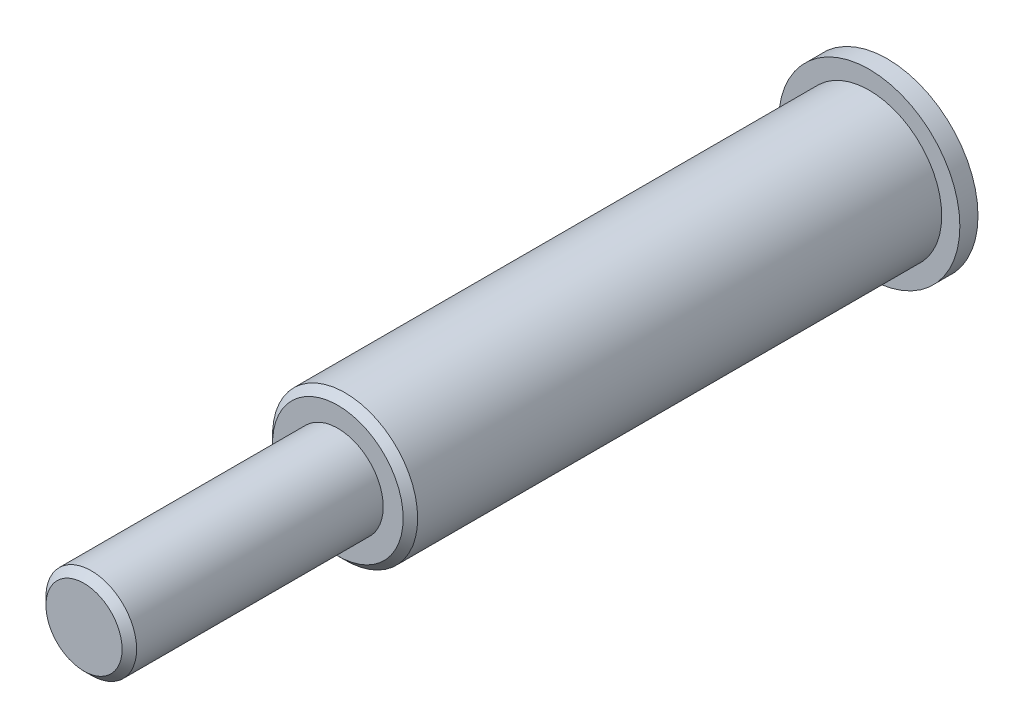
ISO-10303-21;
HEADER;
FILE_DESCRIPTION(('STEP AP214'),'2;1');
FILE_NAME('part.step','',(''),(''),'','','');
FILE_SCHEMA(('AUTOMOTIVE_DESIGN { 1 0 10303 214 1 1 1 1 }'));
ENDSEC;
DATA;
#1=APPLICATION_CONTEXT('core data for automotive mechanical design processes');
#2=APPLICATION_PROTOCOL_DEFINITION('international standard','automotive_design',2000,#1);
#3=PRODUCT_CONTEXT('',#1,'mechanical');
#4=PRODUCT('Part','Part','',(#3));
#5=PRODUCT_RELATED_PRODUCT_CATEGORY('part','',(#4));
#6=PRODUCT_DEFINITION_FORMATION('','',#4);
#7=PRODUCT_DEFINITION_CONTEXT('part definition',#1,'design');
#8=PRODUCT_DEFINITION('design','',#6,#7);
#9=PRODUCT_DEFINITION_SHAPE('','',#8);
#10=(LENGTH_UNIT() NAMED_UNIT(*) SI_UNIT(.MILLI.,.METRE.));
#11=(NAMED_UNIT(*) PLANE_ANGLE_UNIT() SI_UNIT($,.RADIAN.));
#12=(NAMED_UNIT(*) SI_UNIT($,.STERADIAN.) SOLID_ANGLE_UNIT());
#13=UNCERTAINTY_MEASURE_WITH_UNIT(LENGTH_MEASURE(1.E-05),#10,'distance_accuracy_value','');
#14=(GEOMETRIC_REPRESENTATION_CONTEXT(3) GLOBAL_UNCERTAINTY_ASSIGNED_CONTEXT((#13)) GLOBAL_UNIT_ASSIGNED_CONTEXT((#10,
#11,#12)) REPRESENTATION_CONTEXT('',''));
#15=CARTESIAN_POINT('',(0.,0.,0.));
#16=DIRECTION('',(0.,0.,1.));
#17=DIRECTION('',(1.,0.,0.));
#18=AXIS2_PLACEMENT_3D('',#15,#16,#17);
#19=CARTESIAN_POINT('',(0.,0.,29.3));
#20=DIRECTION('',(0.,0.,-1.));
#21=DIRECTION('',(-1.,0.,0.));
#22=AXIS2_PLACEMENT_3D('',#19,#20,#21);
#23=CYLINDRICAL_SURFACE('',#22,4.);
#24=CARTESIAN_POINT('',(0.,0.,28.9));
#25=DIRECTION('',(0.,0.,1.));
#26=DIRECTION('',(1.,0.,0.));
#27=AXIS2_PLACEMENT_3D('',#24,#25,#26);
#28=CIRCLE('',#27,4.);
#29=CARTESIAN_POINT('',(4.,0.,28.9));
#30=VERTEX_POINT('',#29);
#31=EDGE_CURVE('E52',#30,#30,#28,.F.);
#32=ORIENTED_EDGE('',*,*,#31,.T.);
#33=EDGE_LOOP('',(#32));
#34=FACE_BOUND('',#33,.T.);
#35=CARTESIAN_POINT('',(0.,0.,0.));
#36=DIRECTION('',(0.,0.,1.));
#37=DIRECTION('',(1.,0.,0.));
#38=AXIS2_PLACEMENT_3D('',#35,#36,#37);
#39=CIRCLE('',#38,4.);
#40=CARTESIAN_POINT('',(4.,0.,0.));
#41=VERTEX_POINT('',#40);
#42=EDGE_CURVE('E64',#41,#41,#39,.T.);
#43=ORIENTED_EDGE('',*,*,#42,.T.);
#44=EDGE_LOOP('',(#43));
#45=FACE_BOUND('',#44,.T.);
#46=ADVANCED_FACE('F38',(#34,#45),#23,.T.);
#47=CARTESIAN_POINT('',(0.,0.,29.3));
#48=DIRECTION('',(0.,0.,1.));
#49=DIRECTION('',(1.,0.,0.));
#50=AXIS2_PLACEMENT_3D('',#47,#48,#49);
#51=PLANE('',#50);
#52=CARTESIAN_POINT('',(0.,0.,29.3));
#53=DIRECTION('',(0.,0.,1.));
#54=DIRECTION('',(1.,0.,0.));
#55=AXIS2_PLACEMENT_3D('',#52,#53,#54);
#56=CIRCLE('',#55,3.6);
#57=CARTESIAN_POINT('',(3.6,0.,29.3));
#58=VERTEX_POINT('',#57);
#59=EDGE_CURVE('E57',#58,#58,#56,.T.);
#60=ORIENTED_EDGE('',*,*,#59,.T.);
#61=EDGE_LOOP('',(#60));
#62=FACE_BOUND('',#61,.T.);
#63=CARTESIAN_POINT('',(0.,0.,29.3));
#64=DIRECTION('',(0.,0.,1.));
#65=DIRECTION('',(1.,0.,0.));
#66=AXIS2_PLACEMENT_3D('',#63,#64,#65);
#67=CIRCLE('',#66,2.5);
#68=CARTESIAN_POINT('',(2.5,0.,29.3));
#69=VERTEX_POINT('',#68);
#70=EDGE_CURVE('E63',#69,#69,#67,.T.);
#71=ORIENTED_EDGE('',*,*,#70,.F.);
#72=EDGE_LOOP('',(#71));
#73=FACE_BOUND('',#72,.T.);
#74=ADVANCED_FACE('F102',(#62,#73),#51,.T.);
#75=CARTESIAN_POINT('',(0.,0.,43.3));
#76=DIRECTION('',(0.,0.,-1.));
#77=DIRECTION('',(-1.,0.,0.));
#78=AXIS2_PLACEMENT_3D('',#75,#76,#77);
#79=CYLINDRICAL_SURFACE('',#78,2.5);
#80=CARTESIAN_POINT('',(0.,0.,42.9));
#81=DIRECTION('',(0.,0.,1.));
#82=DIRECTION('',(1.,0.,0.));
#83=AXIS2_PLACEMENT_3D('',#80,#81,#82);
#84=CIRCLE('',#83,2.5);
#85=CARTESIAN_POINT('',(2.5,0.,42.9));
#86=VERTEX_POINT('',#85);
#87=EDGE_CURVE('E10',#86,#86,#84,.F.);
#88=ORIENTED_EDGE('',*,*,#87,.T.);
#89=EDGE_LOOP('',(#88));
#90=FACE_BOUND('',#89,.T.);
#91=ORIENTED_EDGE('',*,*,#70,.T.);
#92=EDGE_LOOP('',(#91));
#93=FACE_BOUND('',#92,.T.);
#94=ADVANCED_FACE('F108',(#90,#93),#79,.T.);
#95=CARTESIAN_POINT('',(0.,0.,43.3));
#96=DIRECTION('',(0.,0.,1.));
#97=DIRECTION('',(1.,0.,0.));
#98=AXIS2_PLACEMENT_3D('',#95,#96,#97);
#99=PLANE('',#98);
#100=CARTESIAN_POINT('',(0.,0.,43.3));
#101=DIRECTION('',(0.,0.,1.));
#102=DIRECTION('',(1.,0.,0.));
#103=AXIS2_PLACEMENT_3D('',#100,#101,#102);
#104=CIRCLE('',#103,2.1);
#105=CARTESIAN_POINT('',(2.1,0.,43.3));
#106=VERTEX_POINT('',#105);
#107=EDGE_CURVE('E47',#106,#106,#104,.T.);
#108=ORIENTED_EDGE('',*,*,#107,.T.);
#109=EDGE_LOOP('',(#108));
#110=FACE_BOUND('',#109,.T.);
#111=ADVANCED_FACE('F85',(#110),#99,.T.);
#112=CARTESIAN_POINT('',(0.,0.,-1.));
#113=DIRECTION('',(0.,0.,1.));
#114=DIRECTION('',(1.,0.,0.));
#115=AXIS2_PLACEMENT_3D('',#112,#113,#114);
#116=CYLINDRICAL_SURFACE('',#115,5.);
#117=CARTESIAN_POINT('',(0.,0.,-1.));
#118=DIRECTION('',(0.,0.,-1.));
#119=DIRECTION('',(-1.,0.,0.));
#120=AXIS2_PLACEMENT_3D('',#117,#118,#119);
#121=CIRCLE('',#120,5.);
#122=CARTESIAN_POINT('',(-5.,0.,-1.));
#123=VERTEX_POINT('',#122);
#124=EDGE_CURVE('E68',#123,#123,#121,.T.);
#125=ORIENTED_EDGE('',*,*,#124,.F.);
#126=EDGE_LOOP('',(#125));
#127=FACE_BOUND('',#126,.T.);
#128=CARTESIAN_POINT('',(0.,0.,0.));
#129=DIRECTION('',(0.,0.,-1.));
#130=DIRECTION('',(-1.,0.,0.));
#131=AXIS2_PLACEMENT_3D('',#128,#129,#130);
#132=CIRCLE('',#131,5.);
#133=CARTESIAN_POINT('',(-5.,0.,0.));
#134=VERTEX_POINT('',#133);
#135=EDGE_CURVE('E72',#134,#134,#132,.T.);
#136=ORIENTED_EDGE('',*,*,#135,.T.);
#137=EDGE_LOOP('',(#136));
#138=FACE_BOUND('',#137,.T.);
#139=ADVANCED_FACE('F82',(#127,#138),#116,.T.);
#140=CARTESIAN_POINT('',(0.,0.,-1.));
#141=DIRECTION('',(0.,0.,-1.));
#142=DIRECTION('',(-1.,0.,0.));
#143=AXIS2_PLACEMENT_3D('',#140,#141,#142);
#144=PLANE('',#143);
#145=ORIENTED_EDGE('',*,*,#124,.T.);
#146=EDGE_LOOP('',(#145));
#147=FACE_BOUND('',#146,.T.);
#148=ADVANCED_FACE('F80',(#147),#144,.T.);
#149=CARTESIAN_POINT('',(0.,0.,0.));
#150=DIRECTION('',(0.,0.,-1.));
#151=DIRECTION('',(-1.,0.,0.));
#152=AXIS2_PLACEMENT_3D('',#149,#150,#151);
#153=PLANE('',#152);
#154=ORIENTED_EDGE('',*,*,#42,.F.);
#155=EDGE_LOOP('',(#154));
#156=FACE_BOUND('',#155,.T.);
#157=ORIENTED_EDGE('',*,*,#135,.F.);
#158=EDGE_LOOP('',(#157));
#159=FACE_BOUND('',#158,.T.);
#160=ADVANCED_FACE('F89',(#156,#159),#153,.F.);
#161=CARTESIAN_POINT('',(0.,0.,29.3));
#162=DIRECTION('',(0.,0.,-1.));
#163=DIRECTION('',(-1.,0.,0.));
#164=AXIS2_PLACEMENT_3D('',#161,#162,#163);
#165=CONICAL_SURFACE('',#164,3.6,0.785398163397444);
#166=ORIENTED_EDGE('',*,*,#31,.F.);
#167=EDGE_LOOP('',(#166));
#168=FACE_BOUND('',#167,.T.);
#169=ORIENTED_EDGE('',*,*,#59,.F.);
#170=EDGE_LOOP('',(#169));
#171=FACE_BOUND('',#170,.T.);
#172=ADVANCED_FACE('F91',(#168,#171),#165,.T.);
#173=CARTESIAN_POINT('',(0.,0.,43.3));
#174=DIRECTION('',(0.,0.,-1.));
#175=DIRECTION('',(-1.,0.,0.));
#176=AXIS2_PLACEMENT_3D('',#173,#174,#175);
#177=CONICAL_SURFACE('',#176,2.1,0.785398163397446);
#178=ORIENTED_EDGE('',*,*,#87,.F.);
#179=EDGE_LOOP('',(#178));
#180=FACE_BOUND('',#179,.T.);
#181=ORIENTED_EDGE('',*,*,#107,.F.);
#182=EDGE_LOOP('',(#181));
#183=FACE_BOUND('',#182,.T.);
#184=ADVANCED_FACE('F41',(#180,#183),#177,.T.);
#185=CLOSED_SHELL('',(#46,#74,#94,#111,#139,#148,#160,#172,#184));
#186=MANIFOLD_SOLID_BREP('B2',#185);
#187=ADVANCED_BREP_SHAPE_REPRESENTATION('',(#18,#186),#14);
#188=SHAPE_DEFINITION_REPRESENTATION(#9,#187);
ENDSEC;
END-ISO-10303-21;
